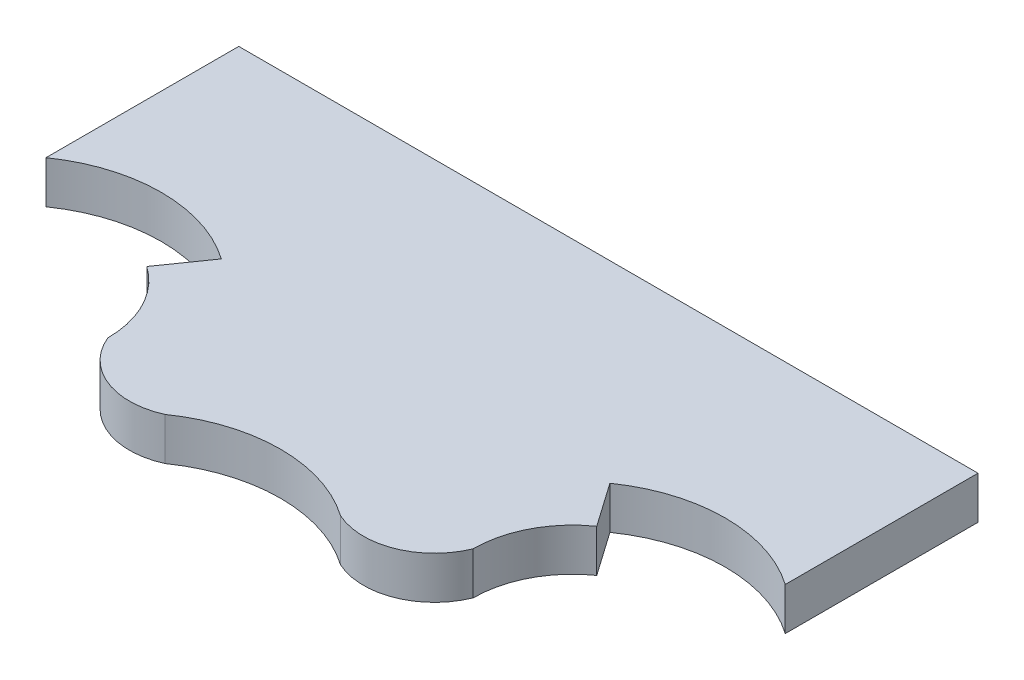
ISO-10303-21;
HEADER;
FILE_DESCRIPTION(('STEP AP214'),'2;1');
FILE_NAME('part.step','',(''),(''),'','','');
FILE_SCHEMA(('AUTOMOTIVE_DESIGN { 1 0 10303 214 1 1 1 1 }'));
ENDSEC;
DATA;
#1=APPLICATION_CONTEXT('core data for automotive mechanical design processes');
#2=APPLICATION_PROTOCOL_DEFINITION('international standard','automotive_design',2000,#1);
#3=PRODUCT_CONTEXT('',#1,'mechanical');
#4=PRODUCT('Part','Part','',(#3));
#5=PRODUCT_RELATED_PRODUCT_CATEGORY('part','',(#4));
#6=PRODUCT_DEFINITION_FORMATION('','',#4);
#7=PRODUCT_DEFINITION_CONTEXT('part definition',#1,'design');
#8=PRODUCT_DEFINITION('design','',#6,#7);
#9=PRODUCT_DEFINITION_SHAPE('','',#8);
#10=(LENGTH_UNIT() NAMED_UNIT(*) SI_UNIT(.MILLI.,.METRE.));
#11=(NAMED_UNIT(*) PLANE_ANGLE_UNIT() SI_UNIT($,.RADIAN.));
#12=(NAMED_UNIT(*) SI_UNIT($,.STERADIAN.) SOLID_ANGLE_UNIT());
#13=UNCERTAINTY_MEASURE_WITH_UNIT(LENGTH_MEASURE(1.E-05),#10,'distance_accuracy_value','');
#14=(GEOMETRIC_REPRESENTATION_CONTEXT(3) GLOBAL_UNCERTAINTY_ASSIGNED_CONTEXT((#13)) GLOBAL_UNIT_ASSIGNED_CONTEXT((#10,
#11,#12)) REPRESENTATION_CONTEXT('',''));
#15=CARTESIAN_POINT('',(0.,0.,0.));
#16=DIRECTION('',(0.,0.,1.));
#17=DIRECTION('',(1.,0.,0.));
#18=AXIS2_PLACEMENT_3D('',#15,#16,#17);
#19=CARTESIAN_POINT('',(-19.8752830168529,3.,-11.4749999999999));
#20=DIRECTION('',(0.,-1.,0.));
#21=DIRECTION('',(0.,0.,-1.));
#22=AXIS2_PLACEMENT_3D('',#19,#20,#21);
#23=CYLINDRICAL_SURFACE('',#22,10.775);
#24=CARTESIAN_POINT('',(-19.8752830168529,0.,-11.4749999999999));
#25=DIRECTION('',(0.,-1.,0.));
#26=DIRECTION('',(0.,0.,-1.));
#27=AXIS2_PLACEMENT_3D('',#24,#25,#26);
#28=CIRCLE('',#27,10.775);
#29=CARTESIAN_POINT('',(-26.0555691185354,0.,-20.3013632772138));
#30=VERTEX_POINT('',#29);
#31=CARTESIAN_POINT('',(-13.6949969151704,0.,-20.3013632772138));
#32=VERTEX_POINT('',#31);
#33=EDGE_CURVE('E159',#30,#32,#28,.T.);
#34=ORIENTED_EDGE('',*,*,#33,.T.);
#35=DIRECTION('',(0.,-1.,0.));
#36=VECTOR('',#35,1.);
#37=CARTESIAN_POINT('',(-13.6949969151704,3.,-20.3013632772138));
#38=LINE('',#37,#36);
#39=CARTESIAN_POINT('',(-13.6949969151704,3.,-20.3013632772138));
#40=VERTEX_POINT('',#39);
#41=EDGE_CURVE('E11',#40,#32,#38,.T.);
#42=ORIENTED_EDGE('',*,*,#41,.F.);
#43=CARTESIAN_POINT('',(-19.8752830168529,3.,-11.4749999999999));
#44=DIRECTION('',(0.,-1.,0.));
#45=DIRECTION('',(0.,0.,-1.));
#46=AXIS2_PLACEMENT_3D('',#43,#44,#45);
#47=CIRCLE('',#46,10.775);
#48=CARTESIAN_POINT('',(-26.0555691185354,3.,-20.3013632772138));
#49=VERTEX_POINT('',#48);
#50=EDGE_CURVE('E181',#49,#40,#47,.T.);
#51=ORIENTED_EDGE('',*,*,#50,.F.);
#52=DIRECTION('',(0.,-1.,0.));
#53=VECTOR('',#52,1.);
#54=CARTESIAN_POINT('',(-26.0555691185354,3.,-20.3013632772138));
#55=LINE('',#54,#53);
#56=EDGE_CURVE('E155',#49,#30,#55,.T.);
#57=ORIENTED_EDGE('',*,*,#56,.T.);
#58=EDGE_LOOP('',(#34,#42,#51,#57));
#59=FACE_BOUND('',#58,.T.);
#60=ADVANCED_FACE('F39',(#59),#23,.F.);
#61=CARTESIAN_POINT('',(-15.8602479623956,3.,-17.2090643100228));
#62=DIRECTION('',(0.819152044288993,0.,0.573576436351044));
#63=DIRECTION('',(0.573576436351044,0.,-0.819152044288993));
#64=AXIS2_PLACEMENT_3D('',#61,#62,#63);
#65=PLANE('',#64);
#66=DIRECTION('',(-0.573576436351044,0.,0.819152044288993));
#67=VECTOR('',#66,1.);
#68=CARTESIAN_POINT('',(-15.8602479623956,0.,-17.2090643100228));
#69=LINE('',#68,#67);
#70=CARTESIAN_POINT('',(-15.8602479623956,0.,-17.2090643100228));
#71=VERTEX_POINT('',#70);
#72=EDGE_CURVE('E162',#32,#71,#69,.T.);
#73=ORIENTED_EDGE('',*,*,#72,.T.);
#74=DIRECTION('',(0.,-1.,0.));
#75=VECTOR('',#74,1.);
#76=CARTESIAN_POINT('',(-15.8602479623956,3.,-17.2090643100228));
#77=LINE('',#76,#75);
#78=CARTESIAN_POINT('',(-15.8602479623956,3.,-17.2090643100228));
#79=VERTEX_POINT('',#78);
#80=EDGE_CURVE('E47',#79,#71,#77,.T.);
#81=ORIENTED_EDGE('',*,*,#80,.F.);
#82=DIRECTION('',(-0.573576436351044,0.,0.819152044288993));
#83=VECTOR('',#82,1.);
#84=CARTESIAN_POINT('',(-15.8602479623956,3.,-17.2090643100228));
#85=LINE('',#84,#83);
#86=EDGE_CURVE('E110',#40,#79,#85,.T.);
#87=ORIENTED_EDGE('',*,*,#86,.F.);
#88=ORIENTED_EDGE('',*,*,#41,.T.);
#89=EDGE_LOOP('',(#73,#81,#87,#88));
#90=FACE_BOUND('',#89,.T.);
#91=ADVANCED_FACE('F259',(#90),#65,.F.);
#92=CARTESIAN_POINT('',(-19.875283016853,3.,-11.4749999999998));
#93=DIRECTION('',(0.,-1.,0.));
#94=DIRECTION('',(0.,0.,-1.));
#95=AXIS2_PLACEMENT_3D('',#92,#93,#94);
#96=CYLINDRICAL_SURFACE('',#95,7.00000000000008);
#97=CARTESIAN_POINT('',(-19.875283016853,0.,-11.4749999999998));
#98=DIRECTION('',(0.,-1.,0.));
#99=DIRECTION('',(0.,0.,-1.));
#100=AXIS2_PLACEMENT_3D('',#97,#98,#99);
#101=CIRCLE('',#100,7.00000000000008);
#102=CARTESIAN_POINT('',(-12.8752830168529,0.,-11.4749999999999));
#103=VERTEX_POINT('',#102);
#104=EDGE_CURVE('E164',#71,#103,#101,.T.);
#105=ORIENTED_EDGE('',*,*,#104,.T.);
#106=DIRECTION('',(0.,-1.,0.));
#107=VECTOR('',#106,1.);
#108=CARTESIAN_POINT('',(-12.8752830168529,3.,-11.4749999999999));
#109=LINE('',#108,#107);
#110=CARTESIAN_POINT('',(-12.8752830168529,3.,-11.4749999999999));
#111=VERTEX_POINT('',#110);
#112=EDGE_CURVE('E200',#111,#103,#109,.T.);
#113=ORIENTED_EDGE('',*,*,#112,.F.);
#114=CARTESIAN_POINT('',(-19.875283016853,3.,-11.4749999999998));
#115=DIRECTION('',(0.,-1.,0.));
#116=DIRECTION('',(0.,0.,-1.));
#117=AXIS2_PLACEMENT_3D('',#114,#115,#116);
#118=CIRCLE('',#117,7.00000000000008);
#119=EDGE_CURVE('E208',#79,#111,#118,.T.);
#120=ORIENTED_EDGE('',*,*,#119,.F.);
#121=ORIENTED_EDGE('',*,*,#80,.T.);
#122=EDGE_LOOP('',(#105,#113,#120,#121));
#123=FACE_BOUND('',#122,.T.);
#124=ADVANCED_FACE('F206',(#123),#96,.F.);
#125=CARTESIAN_POINT('',(-8.25129203559566,3.,-13.3772900423571));
#126=DIRECTION('',(0.,-1.,0.));
#127=DIRECTION('',(0.,0.,-1.));
#128=AXIS2_PLACEMENT_3D('',#125,#126,#127);
#129=CYLINDRICAL_SURFACE('',#128,5.);
#130=CARTESIAN_POINT('',(-8.25129203559566,0.,-13.3772900423571));
#131=DIRECTION('',(0.,1.,0.));
#132=DIRECTION('',(0.,0.,1.));
#133=AXIS2_PLACEMENT_3D('',#130,#131,#132);
#134=CIRCLE('',#133,5.);
#135=CARTESIAN_POINT('',(-6.18028610168251,0.,-8.82636327721389));
#136=VERTEX_POINT('',#135);
#137=EDGE_CURVE('E166',#103,#136,#134,.T.);
#138=ORIENTED_EDGE('',*,*,#137,.T.);
#139=DIRECTION('',(0.,-1.,0.));
#140=VECTOR('',#139,1.);
#141=CARTESIAN_POINT('',(-6.18028610168251,3.,-8.82636327721389));
#142=LINE('',#141,#140);
#143=CARTESIAN_POINT('',(-6.18028610168251,3.,-8.82636327721389));
#144=VERTEX_POINT('',#143);
#145=EDGE_CURVE('E197',#144,#136,#142,.T.);
#146=ORIENTED_EDGE('',*,*,#145,.F.);
#147=CARTESIAN_POINT('',(-8.25129203559566,3.,-13.3772900423571));
#148=DIRECTION('',(0.,1.,0.));
#149=DIRECTION('',(0.,0.,1.));
#150=AXIS2_PLACEMENT_3D('',#147,#148,#149);
#151=CIRCLE('',#150,5.);
#152=EDGE_CURVE('E226',#111,#144,#151,.T.);
#153=ORIENTED_EDGE('',*,*,#152,.F.);
#154=ORIENTED_EDGE('',*,*,#112,.T.);
#155=EDGE_LOOP('',(#138,#146,#153,#154));
#156=FACE_BOUND('',#155,.T.);
#157=ADVANCED_FACE('F217',(#156),#129,.T.);
#158=CARTESIAN_POINT('',(0.,3.,0.));
#159=DIRECTION('',(0.,-1.,0.));
#160=DIRECTION('',(0.,0.,-1.));
#161=AXIS2_PLACEMENT_3D('',#158,#159,#160);
#162=CYLINDRICAL_SURFACE('',#161,10.775);
#163=CARTESIAN_POINT('',(0.,0.,0.));
#164=DIRECTION('',(0.,-1.,0.));
#165=DIRECTION('',(0.,0.,-1.));
#166=AXIS2_PLACEMENT_3D('',#163,#164,#165);
#167=CIRCLE('',#166,10.775);
#168=CARTESIAN_POINT('',(6.18028610168249,0.,-8.8263632772139));
#169=VERTEX_POINT('',#168);
#170=EDGE_CURVE('E168',#136,#169,#167,.T.);
#171=ORIENTED_EDGE('',*,*,#170,.T.);
#172=DIRECTION('',(0.,-1.,0.));
#173=VECTOR('',#172,1.);
#174=CARTESIAN_POINT('',(6.18028610168249,3.,-8.8263632772139));
#175=LINE('',#174,#173);
#176=CARTESIAN_POINT('',(6.18028610168249,3.,-8.8263632772139));
#177=VERTEX_POINT('',#176);
#178=EDGE_CURVE('E194',#177,#169,#175,.T.);
#179=ORIENTED_EDGE('',*,*,#178,.F.);
#180=CARTESIAN_POINT('',(0.,3.,0.));
#181=DIRECTION('',(0.,-1.,0.));
#182=DIRECTION('',(0.,0.,-1.));
#183=AXIS2_PLACEMENT_3D('',#180,#181,#182);
#184=CIRCLE('',#183,10.775);
#185=EDGE_CURVE('E223',#144,#177,#184,.T.);
#186=ORIENTED_EDGE('',*,*,#185,.F.);
#187=ORIENTED_EDGE('',*,*,#145,.T.);
#188=EDGE_LOOP('',(#171,#179,#186,#187));
#189=FACE_BOUND('',#188,.T.);
#190=ADVANCED_FACE('F221',(#189),#162,.F.);
#191=CARTESIAN_POINT('',(8.25129203559566,3.,-13.3772900423571));
#192=DIRECTION('',(0.,-1.,0.));
#193=DIRECTION('',(0.,0.,-1.));
#194=AXIS2_PLACEMENT_3D('',#191,#192,#193);
#195=CYLINDRICAL_SURFACE('',#194,5.00000000000001);
#196=CARTESIAN_POINT('',(8.25129203559566,0.,-13.3772900423571));
#197=DIRECTION('',(0.,1.,0.));
#198=DIRECTION('',(0.,0.,1.));
#199=AXIS2_PLACEMENT_3D('',#196,#197,#198);
#200=CIRCLE('',#199,5.00000000000001);
#201=CARTESIAN_POINT('',(12.8752830168529,0.,-11.4749999999998));
#202=VERTEX_POINT('',#201);
#203=EDGE_CURVE('E170',#169,#202,#200,.T.);
#204=ORIENTED_EDGE('',*,*,#203,.T.);
#205=DIRECTION('',(0.,-1.,0.));
#206=VECTOR('',#205,1.);
#207=CARTESIAN_POINT('',(12.8752830168529,3.,-11.4749999999998));
#208=LINE('',#207,#206);
#209=CARTESIAN_POINT('',(12.8752830168529,3.,-11.4749999999998));
#210=VERTEX_POINT('',#209);
#211=EDGE_CURVE('E191',#210,#202,#208,.T.);
#212=ORIENTED_EDGE('',*,*,#211,.F.);
#213=CARTESIAN_POINT('',(8.25129203559566,3.,-13.3772900423571));
#214=DIRECTION('',(0.,1.,0.));
#215=DIRECTION('',(0.,0.,1.));
#216=AXIS2_PLACEMENT_3D('',#213,#214,#215);
#217=CIRCLE('',#216,5.00000000000001);
#218=EDGE_CURVE('E225',#177,#210,#217,.T.);
#219=ORIENTED_EDGE('',*,*,#218,.F.);
#220=ORIENTED_EDGE('',*,*,#178,.T.);
#221=EDGE_LOOP('',(#204,#212,#219,#220));
#222=FACE_BOUND('',#221,.T.);
#223=ADVANCED_FACE('F272',(#222),#195,.T.);
#224=CARTESIAN_POINT('',(19.875283016853,3.,-11.4749999999998));
#225=DIRECTION('',(0.,-1.,0.));
#226=DIRECTION('',(0.,0.,-1.));
#227=AXIS2_PLACEMENT_3D('',#224,#225,#226);
#228=CYLINDRICAL_SURFACE('',#227,7.0000000000001);
#229=CARTESIAN_POINT('',(19.875283016853,0.,-11.4749999999998));
#230=DIRECTION('',(0.,-1.,0.));
#231=DIRECTION('',(0.,0.,-1.));
#232=AXIS2_PLACEMENT_3D('',#229,#230,#231);
#233=CIRCLE('',#232,7.0000000000001);
#234=CARTESIAN_POINT('',(15.8602479623956,0.,-17.2090643100228));
#235=VERTEX_POINT('',#234);
#236=EDGE_CURVE('E172',#202,#235,#233,.T.);
#237=ORIENTED_EDGE('',*,*,#236,.T.);
#238=DIRECTION('',(0.,-1.,0.));
#239=VECTOR('',#238,1.);
#240=CARTESIAN_POINT('',(15.8602479623956,3.,-17.2090643100228));
#241=LINE('',#240,#239);
#242=CARTESIAN_POINT('',(15.8602479623956,3.,-17.2090643100228));
#243=VERTEX_POINT('',#242);
#244=EDGE_CURVE('E188',#243,#235,#241,.T.);
#245=ORIENTED_EDGE('',*,*,#244,.F.);
#246=CARTESIAN_POINT('',(19.875283016853,3.,-11.4749999999998));
#247=DIRECTION('',(0.,-1.,0.));
#248=DIRECTION('',(0.,0.,-1.));
#249=AXIS2_PLACEMENT_3D('',#246,#247,#248);
#250=CIRCLE('',#249,7.0000000000001);
#251=EDGE_CURVE('E228',#210,#243,#250,.T.);
#252=ORIENTED_EDGE('',*,*,#251,.F.);
#253=ORIENTED_EDGE('',*,*,#211,.T.);
#254=EDGE_LOOP('',(#237,#245,#252,#253));
#255=FACE_BOUND('',#254,.T.);
#256=ADVANCED_FACE('F275',(#255),#228,.F.);
#257=CARTESIAN_POINT('',(15.8602479623956,3.,-17.2090643100228));
#258=DIRECTION('',(-0.819152044288992,0.,0.573576436351045));
#259=DIRECTION('',(0.573576436351045,0.,0.819152044288992));
#260=AXIS2_PLACEMENT_3D('',#257,#258,#259);
#261=PLANE('',#260);
#262=DIRECTION('',(-0.573576436351045,0.,-0.819152044288992));
#263=VECTOR('',#262,1.);
#264=CARTESIAN_POINT('',(15.8602479623956,0.,-17.2090643100228));
#265=LINE('',#264,#263);
#266=CARTESIAN_POINT('',(13.6949969151704,0.,-20.3013632772138));
#267=VERTEX_POINT('',#266);
#268=EDGE_CURVE('E174',#235,#267,#265,.T.);
#269=ORIENTED_EDGE('',*,*,#268,.T.);
#270=DIRECTION('',(0.,-1.,0.));
#271=VECTOR('',#270,1.);
#272=CARTESIAN_POINT('',(13.6949969151704,3.,-20.3013632772138));
#273=LINE('',#272,#271);
#274=CARTESIAN_POINT('',(13.6949969151704,3.,-20.3013632772138));
#275=VERTEX_POINT('',#274);
#276=EDGE_CURVE('E185',#275,#267,#273,.T.);
#277=ORIENTED_EDGE('',*,*,#276,.F.);
#278=DIRECTION('',(-0.573576436351045,0.,-0.819152044288992));
#279=VECTOR('',#278,1.);
#280=CARTESIAN_POINT('',(15.8602479623956,3.,-17.2090643100228));
#281=LINE('',#280,#279);
#282=EDGE_CURVE('E234',#243,#275,#281,.T.);
#283=ORIENTED_EDGE('',*,*,#282,.F.);
#284=ORIENTED_EDGE('',*,*,#244,.T.);
#285=EDGE_LOOP('',(#269,#277,#283,#284));
#286=FACE_BOUND('',#285,.T.);
#287=ADVANCED_FACE('F240',(#286),#261,.F.);
#288=CARTESIAN_POINT('',(19.8752830168529,3.,-11.4749999999998));
#289=DIRECTION('',(0.,-1.,0.));
#290=DIRECTION('',(0.,0.,-1.));
#291=AXIS2_PLACEMENT_3D('',#288,#289,#290);
#292=CYLINDRICAL_SURFACE('',#291,10.775);
#293=CARTESIAN_POINT('',(19.8752830168529,0.,-11.4749999999998));
#294=DIRECTION('',(0.,-1.,0.));
#295=DIRECTION('',(0.,0.,-1.));
#296=AXIS2_PLACEMENT_3D('',#293,#294,#295);
#297=CIRCLE('',#296,10.775);
#298=CARTESIAN_POINT('',(26.0555691185354,0.,-20.3013632772138));
#299=VERTEX_POINT('',#298);
#300=EDGE_CURVE('E176',#267,#299,#297,.T.);
#301=ORIENTED_EDGE('',*,*,#300,.T.);
#302=DIRECTION('',(0.,-1.,0.));
#303=VECTOR('',#302,1.);
#304=CARTESIAN_POINT('',(26.0555691185354,3.,-20.3013632772138));
#305=LINE('',#304,#303);
#306=CARTESIAN_POINT('',(26.0555691185354,3.,-20.3013632772138));
#307=VERTEX_POINT('',#306);
#308=EDGE_CURVE('E150',#307,#299,#305,.T.);
#309=ORIENTED_EDGE('',*,*,#308,.F.);
#310=CARTESIAN_POINT('',(19.8752830168529,3.,-11.4749999999998));
#311=DIRECTION('',(0.,-1.,0.));
#312=DIRECTION('',(0.,0.,-1.));
#313=AXIS2_PLACEMENT_3D('',#310,#311,#312);
#314=CIRCLE('',#313,10.775);
#315=EDGE_CURVE('E141',#275,#307,#314,.T.);
#316=ORIENTED_EDGE('',*,*,#315,.F.);
#317=ORIENTED_EDGE('',*,*,#276,.T.);
#318=EDGE_LOOP('',(#301,#309,#316,#317));
#319=FACE_BOUND('',#318,.T.);
#320=ADVANCED_FACE('F244',(#319),#292,.F.);
#321=CARTESIAN_POINT('',(26.0555691185354,3.,-33.8892135655432));
#322=DIRECTION('',(-1.,0.,0.));
#323=DIRECTION('',(0.,0.,1.));
#324=AXIS2_PLACEMENT_3D('',#321,#322,#323);
#325=PLANE('',#324);
#326=DIRECTION('',(0.,0.,-1.));
#327=VECTOR('',#326,1.);
#328=CARTESIAN_POINT('',(26.0555691185354,0.,-33.8892135655432));
#329=LINE('',#328,#327);
#330=CARTESIAN_POINT('',(26.0555691185354,0.,-33.8892135655432));
#331=VERTEX_POINT('',#330);
#332=EDGE_CURVE('E149',#299,#331,#329,.T.);
#333=ORIENTED_EDGE('',*,*,#332,.T.);
#334=DIRECTION('',(0.,-1.,0.));
#335=VECTOR('',#334,1.);
#336=CARTESIAN_POINT('',(26.0555691185354,3.,-33.8892135655432));
#337=LINE('',#336,#335);
#338=CARTESIAN_POINT('',(26.0555691185354,3.,-33.8892135655432));
#339=VERTEX_POINT('',#338);
#340=EDGE_CURVE('E146',#339,#331,#337,.T.);
#341=ORIENTED_EDGE('',*,*,#340,.F.);
#342=DIRECTION('',(0.,0.,-1.));
#343=VECTOR('',#342,1.);
#344=CARTESIAN_POINT('',(26.0555691185354,3.,-33.8892135655432));
#345=LINE('',#344,#343);
#346=EDGE_CURVE('E135',#307,#339,#345,.T.);
#347=ORIENTED_EDGE('',*,*,#346,.F.);
#348=ORIENTED_EDGE('',*,*,#308,.T.);
#349=EDGE_LOOP('',(#333,#341,#347,#348));
#350=FACE_BOUND('',#349,.T.);
#351=ADVANCED_FACE('F147',(#350),#325,.F.);
#352=CARTESIAN_POINT('',(-26.0555691185354,3.,-33.8892135655432));
#353=DIRECTION('',(0.,0.,1.));
#354=DIRECTION('',(1.,0.,0.));
#355=AXIS2_PLACEMENT_3D('',#352,#353,#354);
#356=PLANE('',#355);
#357=DIRECTION('',(-1.,0.,0.));
#358=VECTOR('',#357,1.);
#359=CARTESIAN_POINT('',(-26.0555691185354,0.,-33.8892135655432));
#360=LINE('',#359,#358);
#361=CARTESIAN_POINT('',(-26.0555691185354,0.,-33.8892135655432));
#362=VERTEX_POINT('',#361);
#363=EDGE_CURVE('E96',#331,#362,#360,.T.);
#364=ORIENTED_EDGE('',*,*,#363,.T.);
#365=DIRECTION('',(0.,-1.,0.));
#366=VECTOR('',#365,1.);
#367=CARTESIAN_POINT('',(-26.0555691185354,3.,-33.8892135655432));
#368=LINE('',#367,#366);
#369=CARTESIAN_POINT('',(-26.0555691185354,3.,-33.8892135655432));
#370=VERTEX_POINT('',#369);
#371=EDGE_CURVE('E151',#370,#362,#368,.T.);
#372=ORIENTED_EDGE('',*,*,#371,.F.);
#373=DIRECTION('',(-1.,0.,0.));
#374=VECTOR('',#373,1.);
#375=CARTESIAN_POINT('',(-26.0555691185354,3.,-33.8892135655432));
#376=LINE('',#375,#374);
#377=EDGE_CURVE('E139',#339,#370,#376,.T.);
#378=ORIENTED_EDGE('',*,*,#377,.F.);
#379=ORIENTED_EDGE('',*,*,#340,.T.);
#380=EDGE_LOOP('',(#364,#372,#378,#379));
#381=FACE_BOUND('',#380,.T.);
#382=ADVANCED_FACE('F153',(#381),#356,.F.);
#383=CARTESIAN_POINT('',(-26.0555691185354,3.,-20.3013632772138));
#384=DIRECTION('',(1.,0.,0.));
#385=DIRECTION('',(0.,0.,-1.));
#386=AXIS2_PLACEMENT_3D('',#383,#384,#385);
#387=PLANE('',#386);
#388=DIRECTION('',(0.,0.,1.));
#389=VECTOR('',#388,1.);
#390=CARTESIAN_POINT('',(-26.0555691185354,0.,-20.3013632772138));
#391=LINE('',#390,#389);
#392=EDGE_CURVE('E102',#362,#30,#391,.T.);
#393=ORIENTED_EDGE('',*,*,#392,.T.);
#394=ORIENTED_EDGE('',*,*,#56,.F.);
#395=DIRECTION('',(0.,0.,1.));
#396=VECTOR('',#395,1.);
#397=CARTESIAN_POINT('',(-26.0555691185354,3.,-20.3013632772138));
#398=LINE('',#397,#396);
#399=EDGE_CURVE('E55',#370,#49,#398,.T.);
#400=ORIENTED_EDGE('',*,*,#399,.F.);
#401=ORIENTED_EDGE('',*,*,#371,.T.);
#402=EDGE_LOOP('',(#393,#394,#400,#401));
#403=FACE_BOUND('',#402,.T.);
#404=ADVANCED_FACE('F248',(#403),#387,.F.);
#405=CARTESIAN_POINT('',(-19.8752830168529,3.,-11.4749999999999));
#406=DIRECTION('',(0.,-1.,0.));
#407=DIRECTION('',(0.,0.,-1.));
#408=AXIS2_PLACEMENT_3D('',#405,#406,#407);
#409=PLANE('',#408);
#410=ORIENTED_EDGE('',*,*,#50,.T.);
#411=ORIENTED_EDGE('',*,*,#86,.T.);
#412=ORIENTED_EDGE('',*,*,#119,.T.);
#413=ORIENTED_EDGE('',*,*,#152,.T.);
#414=ORIENTED_EDGE('',*,*,#185,.T.);
#415=ORIENTED_EDGE('',*,*,#218,.T.);
#416=ORIENTED_EDGE('',*,*,#251,.T.);
#417=ORIENTED_EDGE('',*,*,#282,.T.);
#418=ORIENTED_EDGE('',*,*,#315,.T.);
#419=ORIENTED_EDGE('',*,*,#346,.T.);
#420=ORIENTED_EDGE('',*,*,#377,.T.);
#421=ORIENTED_EDGE('',*,*,#399,.T.);
#422=EDGE_LOOP('',(#410,#411,#412,#413,#414,#415,#416,#417,#418,#419,#420,#421));
#423=FACE_BOUND('',#422,.T.);
#424=ADVANCED_FACE('F137',(#423),#409,.F.);
#425=CARTESIAN_POINT('',(-19.8752830168529,0.,-11.4749999999999));
#426=DIRECTION('',(0.,-1.,0.));
#427=DIRECTION('',(0.,0.,-1.));
#428=AXIS2_PLACEMENT_3D('',#425,#426,#427);
#429=PLANE('',#428);
#430=ORIENTED_EDGE('',*,*,#33,.F.);
#431=ORIENTED_EDGE('',*,*,#392,.F.);
#432=ORIENTED_EDGE('',*,*,#363,.F.);
#433=ORIENTED_EDGE('',*,*,#332,.F.);
#434=ORIENTED_EDGE('',*,*,#300,.F.);
#435=ORIENTED_EDGE('',*,*,#268,.F.);
#436=ORIENTED_EDGE('',*,*,#236,.F.);
#437=ORIENTED_EDGE('',*,*,#203,.F.);
#438=ORIENTED_EDGE('',*,*,#170,.F.);
#439=ORIENTED_EDGE('',*,*,#137,.F.);
#440=ORIENTED_EDGE('',*,*,#104,.F.);
#441=ORIENTED_EDGE('',*,*,#72,.F.);
#442=EDGE_LOOP('',(#430,#431,#432,#433,#434,#435,#436,#437,#438,#439,#440,#441));
#443=FACE_BOUND('',#442,.T.);
#444=ADVANCED_FACE('F212',(#443),#429,.T.);
#445=CLOSED_SHELL('',(#60,#91,#124,#157,#190,#223,#256,#287,#320,#351,#382,#404,#424,#444));
#446=MANIFOLD_SOLID_BREP('B2',#445);
#447=ADVANCED_BREP_SHAPE_REPRESENTATION('',(#18,#446),#14);
#448=SHAPE_DEFINITION_REPRESENTATION(#9,#447);
ENDSEC;
END-ISO-10303-21;
